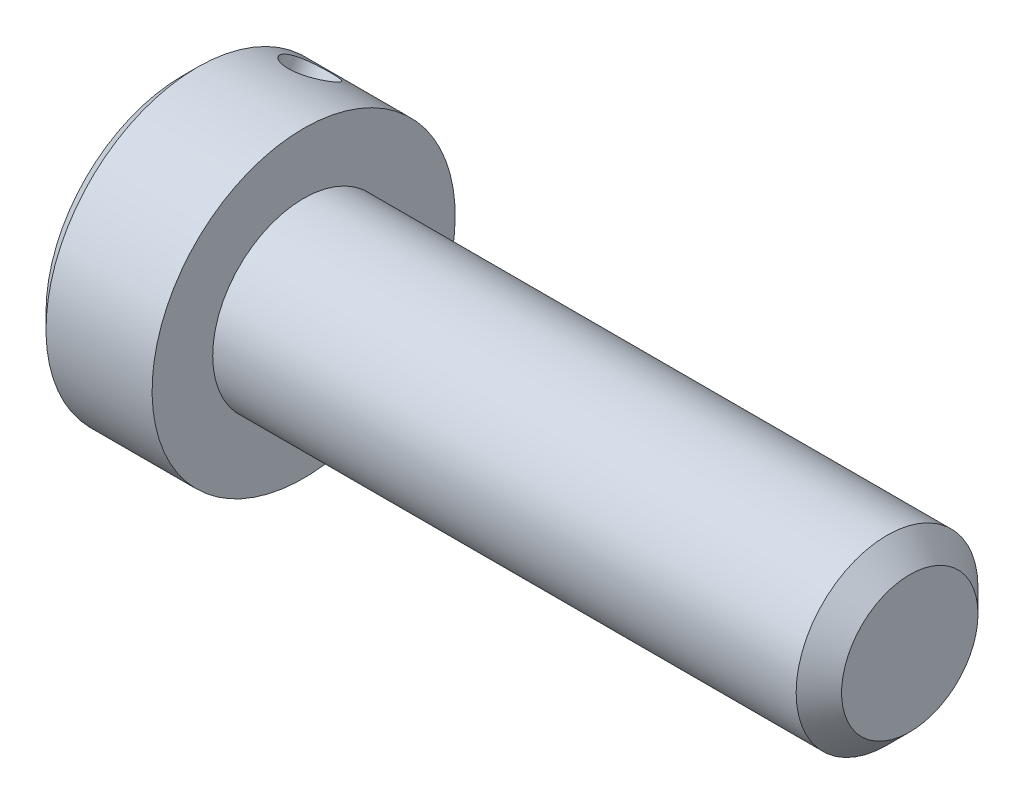
ISO-10303-21;
HEADER;
FILE_DESCRIPTION(('STEP AP214'),'2;1');
FILE_NAME('part.step','',(''),(''),'','','');
FILE_SCHEMA(('AUTOMOTIVE_DESIGN { 1 0 10303 214 1 1 1 1 }'));
ENDSEC;
DATA;
#1=APPLICATION_CONTEXT('core data for automotive mechanical design processes');
#2=APPLICATION_PROTOCOL_DEFINITION('international standard','automotive_design',2000,#1);
#3=PRODUCT_CONTEXT('',#1,'mechanical');
#4=PRODUCT('Part','Part','',(#3));
#5=PRODUCT_RELATED_PRODUCT_CATEGORY('part','',(#4));
#6=PRODUCT_DEFINITION_FORMATION('','',#4);
#7=PRODUCT_DEFINITION_CONTEXT('part definition',#1,'design');
#8=PRODUCT_DEFINITION('design','',#6,#7);
#9=PRODUCT_DEFINITION_SHAPE('','',#8);
#10=(LENGTH_UNIT() NAMED_UNIT(*) SI_UNIT(.MILLI.,.METRE.));
#11=(NAMED_UNIT(*) PLANE_ANGLE_UNIT() SI_UNIT($,.RADIAN.));
#12=(NAMED_UNIT(*) SI_UNIT($,.STERADIAN.) SOLID_ANGLE_UNIT());
#13=UNCERTAINTY_MEASURE_WITH_UNIT(LENGTH_MEASURE(1.E-05),#10,'distance_accuracy_value','');
#14=(GEOMETRIC_REPRESENTATION_CONTEXT(3) GLOBAL_UNCERTAINTY_ASSIGNED_CONTEXT((#13)) GLOBAL_UNIT_ASSIGNED_CONTEXT((#10,
#11,#12)) REPRESENTATION_CONTEXT('',''));
#15=CARTESIAN_POINT('',(0.,0.,0.));
#16=DIRECTION('',(0.,0.,1.));
#17=DIRECTION('',(1.,0.,0.));
#18=AXIS2_PLACEMENT_3D('',#15,#16,#17);
#19=CARTESIAN_POINT('',(-14.,4.5,0.));
#20=DIRECTION('',(-1.,0.,0.));
#21=DIRECTION('',(0.,-1.,0.));
#22=AXIS2_PLACEMENT_3D('',#19,#20,#21);
#23=PLANE('',#22);
#24=CARTESIAN_POINT('',(-14.,0.,0.));
#25=DIRECTION('',(-1.,0.,0.));
#26=DIRECTION('',(0.,-1.,0.));
#27=AXIS2_PLACEMENT_3D('',#24,#25,#26);
#28=CIRCLE('',#27,2.30940107675845);
#29=CARTESIAN_POINT('',(-14.,-2.30940107675842,-1.47451495458029E-13));
#30=VERTEX_POINT('',#29);
#31=CARTESIAN_POINT('',(-14.,-1.15470053837932,1.99999999999988));
#32=VERTEX_POINT('',#31);
#33=EDGE_CURVE('E138',#30,#32,#28,.T.);
#34=ORIENTED_EDGE('',*,*,#33,.F.);
#35=CARTESIAN_POINT('',(-14.,-1.15470053837925,-2.));
#36=VERTEX_POINT('',#35);
#37=EDGE_CURVE('E134',#36,#30,#28,.T.);
#38=ORIENTED_EDGE('',*,*,#37,.F.);
#39=CARTESIAN_POINT('',(-14.,1.15470053837917,-2.));
#40=VERTEX_POINT('',#39);
#41=EDGE_CURVE('E102',#40,#36,#28,.T.);
#42=ORIENTED_EDGE('',*,*,#41,.F.);
#43=CARTESIAN_POINT('',(-14.,2.30940107675848,0.));
#44=VERTEX_POINT('',#43);
#45=EDGE_CURVE('E94',#44,#40,#28,.T.);
#46=ORIENTED_EDGE('',*,*,#45,.F.);
#47=CARTESIAN_POINT('',(-14.,1.15470053837917,2.));
#48=VERTEX_POINT('',#47);
#49=EDGE_CURVE('E55',#48,#44,#28,.T.);
#50=ORIENTED_EDGE('',*,*,#49,.F.);
#51=EDGE_CURVE('E62',#32,#48,#28,.T.);
#52=ORIENTED_EDGE('',*,*,#51,.F.);
#53=EDGE_LOOP('',(#34,#38,#42,#46,#50,#52));
#54=FACE_BOUND('',#53,.T.);
#55=CARTESIAN_POINT('',(-14.,0.,0.));
#56=DIRECTION('',(1.,0.,0.));
#57=DIRECTION('',(0.,1.,0.));
#58=AXIS2_PLACEMENT_3D('',#55,#56,#57);
#59=CIRCLE('',#58,4.5);
#60=CARTESIAN_POINT('',(-14.,4.5,0.));
#61=VERTEX_POINT('',#60);
#62=EDGE_CURVE('E265',#61,#61,#59,.T.);
#63=ORIENTED_EDGE('',*,*,#62,.F.);
#64=EDGE_LOOP('',(#63));
#65=FACE_BOUND('',#64,.T.);
#66=ADVANCED_FACE('F39',(#54,#65),#23,.T.);
#67=CARTESIAN_POINT('',(-10.,0.,0.));
#68=DIRECTION('',(1.,0.,0.));
#69=DIRECTION('',(0.,0.,-1.));
#70=AXIS2_PLACEMENT_3D('',#67,#68,#69);
#71=CYLINDRICAL_SURFACE('',#70,3.);
#72=CARTESIAN_POINT('',(9.25,0.,0.));
#73=DIRECTION('',(1.,0.,0.));
#74=DIRECTION('',(0.,0.,-1.));
#75=AXIS2_PLACEMENT_3D('',#72,#73,#74);
#76=CIRCLE('',#75,3.);
#77=CARTESIAN_POINT('',(9.25,0.,-3.));
#78=VERTEX_POINT('',#77);
#79=EDGE_CURVE('E49',#78,#78,#76,.F.);
#80=ORIENTED_EDGE('',*,*,#79,.T.);
#81=EDGE_LOOP('',(#80));
#82=FACE_BOUND('',#81,.T.);
#83=CARTESIAN_POINT('',(-10.,0.,0.));
#84=DIRECTION('',(1.,0.,0.));
#85=DIRECTION('',(0.,1.,0.));
#86=AXIS2_PLACEMENT_3D('',#83,#84,#85);
#87=CIRCLE('',#86,3.);
#88=CARTESIAN_POINT('',(-10.,2.99999999999999,0.));
#89=VERTEX_POINT('',#88);
#90=EDGE_CURVE('E277',#89,#89,#87,.F.);
#91=ORIENTED_EDGE('',*,*,#90,.F.);
#92=EDGE_LOOP('',(#91));
#93=FACE_BOUND('',#92,.T.);
#94=ADVANCED_FACE('F220',(#82,#93),#71,.T.);
#95=CARTESIAN_POINT('',(10.,0.,0.));
#96=DIRECTION('',(1.,0.,0.));
#97=DIRECTION('',(0.,0.,-1.));
#98=AXIS2_PLACEMENT_3D('',#95,#96,#97);
#99=PLANE('',#98);
#100=CARTESIAN_POINT('',(10.,0.,0.));
#101=DIRECTION('',(1.,0.,0.));
#102=DIRECTION('',(0.,0.,-1.));
#103=AXIS2_PLACEMENT_3D('',#100,#101,#102);
#104=CIRCLE('',#103,2.25);
#105=CARTESIAN_POINT('',(10.,0.,-2.25));
#106=VERTEX_POINT('',#105);
#107=EDGE_CURVE('E281',#106,#106,#104,.T.);
#108=ORIENTED_EDGE('',*,*,#107,.T.);
#109=EDGE_LOOP('',(#108));
#110=FACE_BOUND('',#109,.T.);
#111=ADVANCED_FACE('F228',(#110),#99,.T.);
#112=CARTESIAN_POINT('',(10.,0.,0.));
#113=DIRECTION('',(-1.,0.,0.));
#114=DIRECTION('',(0.,0.,1.));
#115=AXIS2_PLACEMENT_3D('',#112,#113,#114);
#116=CONICAL_SURFACE('',#115,2.25,0.785398163397448);
#117=ORIENTED_EDGE('',*,*,#79,.F.);
#118=EDGE_LOOP('',(#117));
#119=FACE_BOUND('',#118,.T.);
#120=ORIENTED_EDGE('',*,*,#107,.F.);
#121=EDGE_LOOP('',(#120));
#122=FACE_BOUND('',#121,.T.);
#123=ADVANCED_FACE('F41',(#119,#122),#116,.T.);
#124=CARTESIAN_POINT('',(-10.,0.,0.));
#125=DIRECTION('',(1.,0.,0.));
#126=DIRECTION('',(0.,1.,0.));
#127=AXIS2_PLACEMENT_3D('',#124,#125,#126);
#128=CYLINDRICAL_SURFACE('',#127,5.);
#129=CARTESIAN_POINT('',(-12.285299495575,-3.87834086626044,3.15570469548312));
#130=CARTESIAN_POINT('',(-12.3295823347327,-3.87834243769697,3.15570351887923));
#131=CARTESIAN_POINT('',(-12.3738901003137,-3.88072162873428,3.15278569398335));
#132=CARTESIAN_POINT('',(-12.4612645817446,-3.89012873115505,3.14117051017463));
#133=CARTESIAN_POINT('',(-12.5043300804723,-3.89716105014666,3.13246767145505));
#134=CARTESIAN_POINT('',(-12.5879427721785,-3.91552918528988,3.10947684026038));
#135=CARTESIAN_POINT('',(-12.6284919556034,-3.92686154821761,3.09519332916734));
#136=CARTESIAN_POINT('',(-12.7059834838848,-3.95330544361432,3.06134532348772));
#137=CARTESIAN_POINT('',(-12.7429262779357,-3.96841650458992,3.04178148773836));
#138=CARTESIAN_POINT('',(-12.8124921637566,-4.00189331275476,2.99760270517462));
#139=CARTESIAN_POINT('',(-12.8450782819461,-4.02028416199412,2.97294855175529));
#140=CARTESIAN_POINT('',(-12.9046850294694,-4.05946902089804,2.91921476103027));
#141=CARTESIAN_POINT('',(-12.931705340744,-4.08026316779366,2.89013487097986));
#142=CARTESIAN_POINT('',(-12.9795511172846,-4.12354979725005,2.82803379145791));
#143=CARTESIAN_POINT('',(-13.0003423446537,-4.14605084396993,2.79499216816026));
#144=CARTESIAN_POINT('',(-13.0349198712189,-4.19180083409682,2.72589810381854));
#145=CARTESIAN_POINT('',(-13.0487065841393,-4.21504973324537,2.68984584074556));
#146=CARTESIAN_POINT('',(-13.0687711200357,-4.26127783308388,2.61598784846331));
#147=CARTESIAN_POINT('',(-13.0751109706555,-4.28425766002934,2.57819936815398));
#148=CARTESIAN_POINT('',(-13.0802945603456,-4.32940820133291,2.50163925417384));
#149=CARTESIAN_POINT('',(-13.079138763707,-4.35157896571997,2.46286768154537));
#150=CARTESIAN_POINT('',(-13.0694125219117,-4.39429004930405,2.38582031755457));
#151=CARTESIAN_POINT('',(-13.0609088197855,-4.41484323302275,2.34754320242254));
#152=CARTESIAN_POINT('',(-13.036833090799,-4.45405623962589,2.27226438495073));
#153=CARTESIAN_POINT('',(-13.0212608646108,-4.47271600909909,2.23526271860947));
#154=CARTESIAN_POINT('',(-12.9834228241877,-4.50786732771196,2.16350108195712));
#155=CARTESIAN_POINT('',(-12.961129218156,-4.52434945766792,2.12875116136466));
#156=CARTESIAN_POINT('',(-12.910501577852,-4.55482711509662,2.0627345849436));
#157=CARTESIAN_POINT('',(-12.8821670990946,-4.56882245945364,2.031468185689));
#158=CARTESIAN_POINT('',(-12.8198910424476,-4.59433911754537,1.97308797969655));
#159=CARTESIAN_POINT('',(-12.7858911593317,-4.60583149246255,1.946023688727));
#160=CARTESIAN_POINT('',(-12.7134466753072,-4.62608556781917,1.89737420812932));
#161=CARTESIAN_POINT('',(-12.6750020404204,-4.63484724738169,1.875789060391));
#162=CARTESIAN_POINT('',(-12.5946961308765,-4.64963141444188,1.83883824019892));
#163=CARTESIAN_POINT('',(-12.5528316584526,-4.65565130279793,1.82347847074239));
#164=CARTESIAN_POINT('',(-12.4669092097325,-4.66494236949695,1.79957736649697));
#165=CARTESIAN_POINT('',(-12.4228514079421,-4.66821376614666,1.79103549018033));
#166=CARTESIAN_POINT('',(-12.3343046768698,-4.67199432264148,1.78115051456332));
#167=CARTESIAN_POINT('',(-12.2898256059924,-4.67253305614586,1.77973034405443));
#168=CARTESIAN_POINT('',(-12.2012517450004,-4.67092953058149,1.78393446837488));
#169=CARTESIAN_POINT('',(-12.1571569415278,-4.66878736508377,1.78955851734086));
#170=CARTESIAN_POINT('',(-12.0708591705648,-4.66183736057946,1.80758510595588));
#171=CARTESIAN_POINT('',(-12.0286468867392,-4.65704471877549,1.81994899523261));
#172=CARTESIAN_POINT('',(-11.9470176408451,-4.64479853338318,1.85097896845154));
#173=CARTESIAN_POINT('',(-11.9076008320522,-4.63734484402485,1.86964539763869));
#174=CARTESIAN_POINT('',(-11.8323172894324,-4.619707181115,1.91281250797798));
#175=CARTESIAN_POINT('',(-11.7964831584572,-4.60950079850739,1.93736088101744));
#176=CARTESIAN_POINT('',(-11.7297183019373,-4.5864215682139,1.99138088015761));
#177=CARTESIAN_POINT('',(-11.6987878883904,-4.57354855098408,2.02085281927429));
#178=CARTESIAN_POINT('',(-11.642413140731,-4.54509469807838,2.08406439760441));
#179=CARTESIAN_POINT('',(-11.6170230149418,-4.5294895845086,2.11784149161551));
#180=CARTESIAN_POINT('',(-11.5728282856836,-4.4958424139724,2.18836128089123));
#181=CARTESIAN_POINT('',(-11.5540234848388,-4.47780043006653,2.22510388723264));
#182=CARTESIAN_POINT('',(-11.5236186650274,-4.43966501926418,2.30024803298763));
#183=CARTESIAN_POINT('',(-11.5119896604643,-4.41958023238527,2.3386422192264));
#184=CARTESIAN_POINT('',(-11.4961729653704,-4.37774373867863,2.41604924799473));
#185=CARTESIAN_POINT('',(-11.4919847216561,-4.35599215589433,2.45506204431613));
#186=CARTESIAN_POINT('',(-11.4911831781837,-4.31165202264835,2.53211597797378));
#187=CARTESIAN_POINT('',(-11.4944871752472,-4.28907529066116,2.57016308126765));
#188=CARTESIAN_POINT('',(-11.5083982283595,-4.24354467333608,2.64466160898534));
#189=CARTESIAN_POINT('',(-11.519005252429,-4.22059078965015,2.68111304039573));
#190=CARTESIAN_POINT('',(-11.5471906813789,-4.17509062099417,2.75143089863935));
#191=CARTESIAN_POINT('',(-11.5647626873041,-4.1525439817,2.78529966429027));
#192=CARTESIAN_POINT('',(-11.6063702664832,-4.10863869371532,2.84966802011476));
#193=CARTESIAN_POINT('',(-11.6304060996184,-4.08728009283213,2.880167474754));
#194=CARTESIAN_POINT('',(-11.6845551159034,-4.04634364186499,2.9374063422887));
#195=CARTESIAN_POINT('',(-11.7147291139269,-4.02678670561494,2.96410318628258));
#196=CARTESIAN_POINT('',(-11.7801700593476,-3.99050051410446,3.01277774257753));
#197=CARTESIAN_POINT('',(-11.815438198549,-3.9737719225453,3.03475434755035));
#198=CARTESIAN_POINT('',(-11.8903311966474,-3.94377451501699,3.07363811342325));
#199=CARTESIAN_POINT('',(-11.9299823083732,-3.93052835232956,3.09051218384864));
#200=CARTESIAN_POINT('',(-12.012319614853,-3.90826150592398,3.11862411423317));
#201=CARTESIAN_POINT('',(-12.0550026690196,-3.89923652121593,3.12986771195247));
#202=CARTESIAN_POINT('',(-12.1291037891965,-3.88784088650351,3.14400172226503));
#203=CARTESIAN_POINT('',(-12.1600686423158,-3.88428694678735,3.14838517860881));
#204=CARTESIAN_POINT('',(-12.2224513144787,-3.87953639725422,3.15423706018974));
#205=CARTESIAN_POINT('',(-12.2538691264962,-3.87833975091122,3.15570553059431));
#206=CARTESIAN_POINT('',(-12.285299495575,-3.87834086626044,3.15570469548312));
#207=B_SPLINE_CURVE_WITH_KNOTS('',3,(#129,#130,#131,#132,#133,#134,#135,#136,#137,#138,#139,
#140,#141,#142,#143,#144,#145,#146,#147,#148,#149,#150,#151,#152,#153,#154,#155,#156,#157,#158,
#159,#160,#161,#162,#163,#164,#165,#166,#167,#168,#169,#170,#171,#172,#173,#174,#175,#176,#177,
#178,#179,#180,#181,#182,#183,#184,#185,#186,#187,#188,#189,#190,#191,#192,#193,#194,#195,#196,
#197,#198,#199,#200,#201,#202,#203,#204,#205,#206),.UNSPECIFIED.,.T.,.F.,(4,2,2,2,2,2,2,2,2,2,2,
2,2,2,2,2,2,2,2,2,2,2,2,2,2,2,2,2,2,2,2,2,2,2,2,2,2,2,4),(0.,0.132733608923278,
0.265593128174596,0.398346177354536,0.531082670308287,0.66488245045565,0.798689874502196,
0.933219813590063,1.06774180569168,1.20113518539877,1.33452030260671,1.46670643240214,
1.59889628999375,1.73164040679474,1.86439429422823,1.9986099557635,2.1328266433897,
2.26717030121812,2.40150328741235,2.53437933437731,2.66725074371804,2.79936808233928,
2.93149265935071,3.06472711330071,3.19797004086408,3.33246339118621,3.46695271011686,
3.60089516036667,3.73482765224459,3.86728893479908,3.99974963732133,4.13208892492339,
4.26443353408485,4.39815951455836,4.53191683183733,4.66652384201559,4.8009933997057,
4.89520440878158,4.98941395805556),.UNSPECIFIED.);
#208=CARTESIAN_POINT('',(-12.285299495575,-3.87834086626044,3.15570469548312));
#209=VERTEX_POINT('',#208);
#210=EDGE_CURVE('E137',#209,#209,#207,.T.);
#211=ORIENTED_EDGE('',*,*,#210,.F.);
#212=EDGE_LOOP('',(#211));
#213=FACE_BOUND('',#212,.T.);
#214=CARTESIAN_POINT('',(-12.285299495575,4.67209086626044,-1.78088936697532));
#215=CARTESIAN_POINT('',(-12.2410166564173,4.67209063300984,-1.78089131618122));
#216=CARTESIAN_POINT('',(-12.1967088908363,4.67075331804487,-1.78441066850794));
#217=CARTESIAN_POINT('',(-12.1093344094055,4.66539782500728,-1.79836505008468));
#218=CARTESIAN_POINT('',(-12.0662689106777,4.66137710508689,-1.80880663633873));
#219=CARTESIAN_POINT('',(-11.9826562189715,4.65065052878979,-1.83620932359023));
#220=CARTESIAN_POINT('',(-11.9421070355467,4.64394682679185,-1.85316519331707));
#221=CARTESIAN_POINT('',(-11.8646155072652,4.62785554170421,-1.89299028134545));
#222=CARTESIAN_POINT('',(-11.8276727132143,4.6184682934376,-1.91585876190313));
#223=CARTESIAN_POINT('',(-11.7581068273934,4.59694674951156,-1.96693991949337));
#224=CARTESIAN_POINT('',(-11.725520709204,4.5847910509613,-1.99519393884149));
#225=CARTESIAN_POINT('',(-11.6659139616806,4.55784865260375,-2.05599591745851));
#226=CARTESIAN_POINT('',(-11.638893650406,4.54306180252865,-2.08854412194534));
#227=CARTESIAN_POINT('',(-11.5910478738654,4.5109240047884,-2.15708198245976));
#228=CARTESIAN_POINT('',(-11.5702566464963,4.49355964299029,-2.19308927217974));
#229=CARTESIAN_POINT('',(-11.5356791199311,4.4565974230831,-2.26725695802337));
#230=CARTESIAN_POINT('',(-11.5218924070107,4.43699969697225,-2.30541722683253));
#231=CARTESIAN_POINT('',(-11.5018278711143,4.39615084930256,-2.38238093180248));
#232=CARTESIAN_POINT('',(-11.4954880204945,4.374914978857,-2.42117628586649));
#233=CARTESIAN_POINT('',(-11.4903044308045,4.33118724588535,-2.49855785862007));
#234=CARTESIAN_POINT('',(-11.491460227443,4.30869546123796,-2.53714409011482));
#235=CARTESIAN_POINT('',(-11.5011864692383,4.26332602851934,-2.61265665551719));
#236=CARTESIAN_POINT('',(-11.5096901713645,4.24045366629076,-2.64959479231225));
#237=CARTESIAN_POINT('',(-11.533765900351,4.1948668012949,-2.72119366092524));
#238=CARTESIAN_POINT('',(-11.5493381265393,4.17215230299761,-2.75585432848843));
#239=CARTESIAN_POINT('',(-11.5871761669623,4.12758056194596,-2.82217708170986));
#240=CARTESIAN_POINT('',(-11.609469772994,4.10572731291138,-2.85382598525643));
#241=CARTESIAN_POINT('',(-11.660097413298,4.06379410937421,-2.91322869904806));
#242=CARTESIAN_POINT('',(-11.6884318920554,4.04371428551337,-2.94098222242325));
#243=CARTESIAN_POINT('',(-11.7507079487025,4.00591387309161,-2.99227039954659));
#244=CARTESIAN_POINT('',(-11.7847078318184,3.98822169703515,-3.01575523365946));
#245=CARTESIAN_POINT('',(-11.8571523158428,3.95621704863495,-3.0576205177473));
#246=CARTESIAN_POINT('',(-11.8955969507296,3.94190460213039,-3.07600092869742));
#247=CARTESIAN_POINT('',(-11.9759028602736,3.91729633668348,-3.10727980304137));
#248=CARTESIAN_POINT('',(-12.0177673326974,3.90700433031587,-3.12017306401393));
#249=CARTESIAN_POINT('',(-12.1036897814176,3.89095090021035,-3.14016991592625));
#250=CARTESIAN_POINT('',(-12.1477475832079,3.88518911664901,-3.14727396668907));
#251=CARTESIAN_POINT('',(-12.2362943142803,3.8785187548963,-3.15549051246253));
#252=CARTESIAN_POINT('',(-12.2807733851576,3.87755821791008,-3.15666715461764));
#253=CARTESIAN_POINT('',(-12.3693472461496,3.88039733359008,-3.15317639858305));
#254=CARTESIAN_POINT('',(-12.4134420496222,3.88419682011789,-3.14850920435993));
#255=CARTESIAN_POINT('',(-12.4997398205852,3.89633330154991,-3.13347702959527));
#256=CARTESIAN_POINT('',(-12.5419521044108,3.90464442285114,-3.12314453540342));
#257=CARTESIAN_POINT('',(-12.6235813503049,3.92539407524134,-3.09702404114476));
#258=CARTESIAN_POINT('',(-12.6629981590978,3.93783283243618,-3.08123574221496));
#259=CARTESIAN_POINT('',(-12.7382817017176,3.96639781514305,-3.044377522902));
#260=CARTESIAN_POINT('',(-12.7741158326928,3.982554138513,-3.02326434976333));
#261=CARTESIAN_POINT('',(-12.8408806892127,4.01779721493405,-2.97626715045929));
#262=CARTESIAN_POINT('',(-12.8718111027596,4.03688415429298,-2.95038282095657));
#263=CARTESIAN_POINT('',(-12.928185850419,4.07740006048733,-2.89413527233963));
#264=CARTESIAN_POINT('',(-12.9535759762083,4.09884932518206,-2.86373230055371));
#265=CARTESIAN_POINT('',(-12.9977707054664,4.14309766889626,-2.79933310146604));
#266=CARTESIAN_POINT('',(-13.0165755063112,4.16589670743623,-2.76533698189818));
#267=CARTESIAN_POINT('',(-13.0469803261226,4.21190574120456,-2.6947386744821));
#268=CARTESIAN_POINT('',(-13.0586093306857,4.23511368840551,-2.65814764569597));
#269=CARTESIAN_POINT('',(-13.0744260257796,4.28123189489704,-2.58321266495659));
#270=CARTESIAN_POINT('',(-13.0786142694939,4.30414217619189,-2.54486884353217));
#271=CARTESIAN_POINT('',(-13.0794158129663,4.34870277357795,-2.46794219490514));
#272=CARTESIAN_POINT('',(-13.0761118159028,4.37036416557725,-2.42936661982286));
#273=CARTESIAN_POINT('',(-13.0622007627905,4.41211647446277,-2.35268668471051));
#274=CARTESIAN_POINT('',(-13.051593738721,4.43220739822551,-2.31458232261778));
#275=CARTESIAN_POINT('',(-13.0234083097711,4.4703543654762,-2.24001909156342));
#276=CARTESIAN_POINT('',(-13.0058363038459,4.48841225727764,-2.20355874633925));
#277=CARTESIAN_POINT('',(-12.9642287246668,4.52220424462914,-2.1333514736718));
#278=CARTESIAN_POINT('',(-12.9401928915317,4.5379382467067,-2.09960465539804));
#279=CARTESIAN_POINT('',(-12.8860438752466,4.56704033459204,-2.03553321515237));
#280=CARTESIAN_POINT('',(-12.8558698772232,4.58038201156658,-2.0052479895427));
#281=CARTESIAN_POINT('',(-12.7904289318025,4.6043923180807,-1.94948594774056));
#282=CARTESIAN_POINT('',(-12.755160792601,4.61506032049652,-1.92401025999438));
#283=CARTESIAN_POINT('',(-12.6802677945027,4.6337359457731,-1.87858986009074));
#284=CARTESIAN_POINT('',(-12.6406166827768,4.64172623808302,-1.85868131148807));
#285=CARTESIAN_POINT('',(-12.558279376297,4.65493846074266,-1.8253416916464));
#286=CARTESIAN_POINT('',(-12.5155963221304,4.66016320964348,-1.81190402676082));
#287=CARTESIAN_POINT('',(-12.4414952019535,4.6667058042753,-1.79496811245134));
#288=CARTESIAN_POINT('',(-12.4105303488342,4.66872501896731,-1.78969858220173));
#289=CARTESIAN_POINT('',(-12.3481476766713,4.67141762230977,-1.78265854483364));
#290=CARTESIAN_POINT('',(-12.3167298646538,4.67209103181333,-1.78088798349897));
#291=CARTESIAN_POINT('',(-12.285299495575,4.67209086626044,-1.78088936697532));
#292=B_SPLINE_CURVE_WITH_KNOTS('',3,(#214,#215,#216,#217,#218,#219,#220,#221,#222,#223,#224,
#225,#226,#227,#228,#229,#230,#231,#232,#233,#234,#235,#236,#237,#238,#239,#240,#241,#242,#243,
#244,#245,#246,#247,#248,#249,#250,#251,#252,#253,#254,#255,#256,#257,#258,#259,#260,#261,#262,
#263,#264,#265,#266,#267,#268,#269,#270,#271,#272,#273,#274,#275,#276,#277,#278,#279,#280,#281,
#282,#283,#284,#285,#286,#287,#288,#289,#290,#291),.UNSPECIFIED.,.T.,.F.,(4,2,2,2,2,2,2,2,2,2,2,
2,2,2,2,2,2,2,2,2,2,2,2,2,2,2,2,2,2,2,2,2,2,2,2,2,2,2,4),(0.,0.132733608923278,
0.265593128174596,0.398346177354536,0.531082670308288,0.664882450455651,0.798689874502197,
0.933219813590062,1.06774180569168,1.20113518539877,1.33452030260671,1.46670643240214,
1.59889628999375,1.73164040679474,1.86439429422824,1.9986099557635,2.1328266433897,
2.26717030121812,2.40150328741235,2.53437933437731,2.66725074371804,2.79936808233928,
2.93149265935071,3.0647271133007,3.19797004086408,3.33246339118621,3.46695271011686,
3.60089516036667,3.73482765224459,3.86728893479908,3.99974963732133,4.13208892492339,
4.26443353408485,4.39815951455836,4.53191683183733,4.6665238420156,4.80099339970571,
4.89520440878158,4.98941395805556),.UNSPECIFIED.);
#293=CARTESIAN_POINT('',(-12.285299495575,4.67209086626044,-1.78088936697532));
#294=VERTEX_POINT('',#293);
#295=EDGE_CURVE('E230',#294,#294,#292,.T.);
#296=ORIENTED_EDGE('',*,*,#295,.F.);
#297=EDGE_LOOP('',(#296));
#298=FACE_BOUND('',#297,.T.);
#299=CARTESIAN_POINT('',(-13.5,0.,0.));
#300=DIRECTION('',(1.,0.,0.));
#301=DIRECTION('',(0.,1.,0.));
#302=AXIS2_PLACEMENT_3D('',#299,#300,#301);
#303=CIRCLE('',#302,5.);
#304=CARTESIAN_POINT('',(-13.5,4.99999999999999,0.));
#305=VERTEX_POINT('',#304);
#306=EDGE_CURVE('E259',#305,#305,#303,.T.);
#307=ORIENTED_EDGE('',*,*,#306,.T.);
#308=EDGE_LOOP('',(#307));
#309=FACE_BOUND('',#308,.T.);
#310=CARTESIAN_POINT('',(-10.,0.,0.));
#311=DIRECTION('',(1.,0.,0.));
#312=DIRECTION('',(0.,1.,0.));
#313=AXIS2_PLACEMENT_3D('',#310,#311,#312);
#314=CIRCLE('',#313,5.);
#315=CARTESIAN_POINT('',(-10.,5.,0.));
#316=VERTEX_POINT('',#315);
#317=EDGE_CURVE('E262',#316,#316,#314,.T.);
#318=ORIENTED_EDGE('',*,*,#317,.F.);
#319=EDGE_LOOP('',(#318));
#320=FACE_BOUND('',#319,.T.);
#321=ADVANCED_FACE('F222',(#213,#298,#309,#320),#128,.T.);
#322=CARTESIAN_POINT('',(-13.5,0.,0.));
#323=DIRECTION('',(1.,0.,0.));
#324=DIRECTION('',(0.,1.,0.));
#325=AXIS2_PLACEMENT_3D('',#322,#323,#324);
#326=CONICAL_SURFACE('',#325,5.,0.785398163397447);
#327=ORIENTED_EDGE('',*,*,#62,.T.);
#328=EDGE_LOOP('',(#327));
#329=FACE_BOUND('',#328,.T.);
#330=ORIENTED_EDGE('',*,*,#306,.F.);
#331=EDGE_LOOP('',(#330));
#332=FACE_BOUND('',#331,.T.);
#333=ADVANCED_FACE('F216',(#329,#332),#326,.T.);
#334=CARTESIAN_POINT('',(-10.,5.,0.));
#335=DIRECTION('',(1.,0.,0.));
#336=DIRECTION('',(0.,1.,0.));
#337=AXIS2_PLACEMENT_3D('',#334,#335,#336);
#338=PLANE('',#337);
#339=ORIENTED_EDGE('',*,*,#90,.T.);
#340=EDGE_LOOP('',(#339));
#341=FACE_BOUND('',#340,.T.);
#342=ORIENTED_EDGE('',*,*,#317,.T.);
#343=EDGE_LOOP('',(#342));
#344=FACE_BOUND('',#343,.T.);
#345=ADVANCED_FACE('F171',(#341,#344),#338,.T.);
#346=CARTESIAN_POINT('',(-14.,0.,0.));
#347=DIRECTION('',(-1.,0.,0.));
#348=DIRECTION('',(0.,-1.,0.));
#349=AXIS2_PLACEMENT_3D('',#346,#347,#348);
#350=CONICAL_SURFACE('',#349,2.30940107675845,0.78539816339745);
#351=CARTESIAN_POINT('',(-14.7407713552808,-2.30294417326428,-2.));
#352=CARTESIAN_POINT('',(-14.6984432738693,-2.24687002696277,-2.));
#353=CARTESIAN_POINT('',(-14.6565251570979,-2.19048190568581,-2.));
#354=CARTESIAN_POINT('',(-14.5736904180752,-2.0769539052615,-2.));
#355=CARTESIAN_POINT('',(-14.5327740498726,-2.01981384095227,-2.));
#356=CARTESIAN_POINT('',(-14.4518334522037,-1.90424016831612,-2.));
#357=CARTESIAN_POINT('',(-14.4118185917352,-1.84579996769761,-2.));
#358=CARTESIAN_POINT('',(-14.3332889938203,-1.72792745485623,-2.));
#359=CARTESIAN_POINT('',(-14.2947741503896,-1.66849521315184,-2.));
#360=CARTESIAN_POINT('',(-14.1776406517203,-1.48162995729571,-2.));
#361=CARTESIAN_POINT('',(-14.1021459018253,-1.35220318180734,-2.));
#362=CARTESIAN_POINT('',(-13.9640493510524,-1.08689521605217,-2.));
#363=CARTESIAN_POINT('',(-13.9014040859441,-0.9510377640356,-2.));
#364=CARTESIAN_POINT('',(-13.8247635439028,-0.747111912337621,-2.));
#365=CARTESIAN_POINT('',(-13.8027671799473,-0.682064034234127,-2.));
#366=CARTESIAN_POINT('',(-13.7639966876877,-0.550398103397343,-2.));
#367=CARTESIAN_POINT('',(-13.7472229191476,-0.483779942833367,-2.));
#368=CARTESIAN_POINT('',(-13.7200482579068,-0.350484328974875,-2.));
#369=CARTESIAN_POINT('',(-13.709538176761,-0.28382948950003,-2.));
#370=CARTESIAN_POINT('',(-13.6950960855565,-0.1498069872904,-2.));
#371=CARTESIAN_POINT('',(-13.69116294474,-0.0824394490928999,-2.));
#372=CARTESIAN_POINT('',(-13.6901664769297,0.0499055621214035,-2.));
#373=CARTESIAN_POINT('',(-13.6928596448403,0.114881284963513,-2.));
#374=CARTESIAN_POINT('',(-13.7044300703996,0.244275921290612,-2.));
#375=CARTESIAN_POINT('',(-13.7133079288032,0.30869478006869,-2.));
#376=CARTESIAN_POINT('',(-13.7369136592515,0.437599788400963,-2.));
#377=CARTESIAN_POINT('',(-13.7517410833942,0.502067428429108,-2.));
#378=CARTESIAN_POINT('',(-13.7864578835601,0.629594322371884,-2.));
#379=CARTESIAN_POINT('',(-13.8063468360306,0.692653693651538,-2.));
#380=CARTESIAN_POINT('',(-13.8764469791435,0.891187888928493,-2.));
#381=CARTESIAN_POINT('',(-13.9346418001747,1.02383545674829,-2.));
#382=CARTESIAN_POINT('',(-14.0640305752409,1.2829093210938,-2.));
#383=CARTESIAN_POINT('',(-14.1352712311583,1.40931112542935,-2.));
#384=CARTESIAN_POINT('',(-14.2464419915628,1.59200441388857,-2.));
#385=CARTESIAN_POINT('',(-14.2831821900084,1.65027548974484,-2.));
#386=CARTESIAN_POINT('',(-14.3582145138206,1.76581760334356,-2.));
#387=CARTESIAN_POINT('',(-14.3965067567377,1.8230885648664,-2.));
#388=CARTESIAN_POINT('',(-14.4740422636669,1.93629654702502,-2.));
#389=CARTESIAN_POINT('',(-14.5132752757023,1.99224062439417,-2.));
#390=CARTESIAN_POINT('',(-14.5927788302714,2.10336423965707,-2.));
#391=CARTESIAN_POINT('',(-14.6330490845185,2.15854398356746,-2.));
#392=CARTESIAN_POINT('',(-14.673744237647,2.21340370625409,-2.));
#393=B_SPLINE_CURVE_WITH_KNOTS('',3,(#351,#352,#353,#354,#355,#356,#357,#358,#359,#360,#361,
#362,#363,#364,#365,#366,#367,#368,#369,#370,#371,#372,#373,#374,#375,#376,#377,#378,#379,#380,
#381,#382,#383,#384,#385,#386,#387,#388,#389,#390,#391,#392),.UNSPECIFIED.,.F.,.F.,(4,2,2,2,2,2,
2,2,2,2,2,2,2,2,2,2,2,2,2,2,4),(0.,0.210772732017011,0.421598374738841,0.634057554744624,
0.846501696032186,1.29562155480994,1.74319622856098,1.94902062142336,2.15485918958133,
2.35699582530217,2.55909770457496,2.75388435576876,2.94868993036095,3.14690093471671,
3.34509535806593,3.77838155838773,4.21325029906867,4.41989056664098,4.6265465143258,
4.83152377076249,5.03644465872345),.UNSPECIFIED.);
#394=EDGE_CURVE('E11',#36,#40,#393,.T.);
#395=ORIENTED_EDGE('',*,*,#394,.T.);
#396=ORIENTED_EDGE('',*,*,#41,.T.);
#397=EDGE_LOOP('',(#395,#396));
#398=FACE_BOUND('',#397,.T.);
#399=ADVANCED_FACE('F107',(#398),#350,.F.);
#400=CARTESIAN_POINT('',(-14.0001154787138,-2.30951654681234,0.000200000000000397));
#401=CARTESIAN_POINT('',(-13.9604530902257,-2.26982196410711,-0.0685530340307059));
#402=CARTESIAN_POINT('',(-13.9231199822843,-2.22946361676571,-0.138455742135513));
#403=CARTESIAN_POINT('',(-13.8547636851362,-2.1471683966763,-0.280995244550439));
#404=CARTESIAN_POINT('',(-13.8237785337373,-2.10522369580641,-0.353645597565362));
#405=CARTESIAN_POINT('',(-13.7707002165442,-2.02064418875706,-0.500141601053977));
#406=CARTESIAN_POINT('',(-13.7484736271767,-1.97803092714268,-0.573949935246301));
#407=CARTESIAN_POINT('',(-13.7142288166752,-1.89186619344272,-0.723191631835273));
#408=CARTESIAN_POINT('',(-13.7021850291442,-1.84831735425552,-0.798620433918162));
#409=CARTESIAN_POINT('',(-13.6913185119057,-1.77326466747239,-0.928615500671091));
#410=CARTESIAN_POINT('',(-13.6897097536101,-1.74185780396624,-0.983013783970121));
#411=CARTESIAN_POINT('',(-13.6924188775988,-1.67909540053411,-1.09172145551971));
#412=CARTESIAN_POINT('',(-13.6967388377581,-1.64773988246021,-1.14603080592135));
#413=CARTESIAN_POINT('',(-13.71105956741,-1.58532489948419,-1.25413672758935));
#414=CARTESIAN_POINT('',(-13.7210666927621,-1.55426580541468,-1.30793265655481));
#415=CARTESIAN_POINT('',(-13.7462124302497,-1.49268469862227,-1.41459426230559));
#416=CARTESIAN_POINT('',(-13.7613506490423,-1.46216264491916,-1.46746001007073));
#417=CARTESIAN_POINT('',(-13.8062945034293,-1.38397803138048,-1.60287973308986));
#418=CARTESIAN_POINT('',(-13.8394888394259,-1.33680037273297,-1.68459383484949));
#419=CARTESIAN_POINT('',(-13.8955258231715,-1.26742988897853,-1.80474703725781));
#420=CARTESIAN_POINT('',(-13.915214702947,-1.2445692346153,-1.84434285210918));
#421=CARTESIAN_POINT('',(-13.9563873183649,-1.19927142554652,-1.92280095888787));
#422=CARTESIAN_POINT('',(-13.9778699516513,-1.17683402097614,-1.96166368359374));
#423=CARTESIAN_POINT('',(-14.0001154787137,-1.15458506832541,-2.0002));
#424=B_SPLINE_CURVE_WITH_KNOTS('',3,(#400,#401,#402,#403,#404,#405,#406,#407,#408,#409,#410,
#411,#412,#413,#414,#415,#416,#417,#418,#419,#420,#421,#422,#423),.UNSPECIFIED.,.F.,.F.,(4,2,2,
2,2,2,2,2,2,2,2,4),(0.,0.266420613771067,0.534393751523395,0.798110374376925,1.06116288956938,
1.24939906803723,1.43770123566249,1.62621426093934,1.81471283831916,2.11415604834146,
2.26347170717791,2.4126962696977),.UNSPECIFIED.);
#425=EDGE_CURVE('E142',#30,#36,#424,.T.);
#426=ORIENTED_EDGE('',*,*,#425,.T.);
#427=ORIENTED_EDGE('',*,*,#37,.T.);
#428=EDGE_LOOP('',(#426,#427));
#429=FACE_BOUND('',#428,.T.);
#430=ADVANCED_FACE('F170',(#429),#350,.F.);
#431=CARTESIAN_POINT('',(-14.0001154787137,-1.15458506832541,2.0002));
#432=CARTESIAN_POINT('',(-13.9604530902257,-1.19427965103064,1.93144696596929));
#433=CARTESIAN_POINT('',(-13.9231199822842,-1.23463799837204,1.86154425786449));
#434=CARTESIAN_POINT('',(-13.8547636851362,-1.31693321846145,1.71900475544957));
#435=CARTESIAN_POINT('',(-13.8237785337373,-1.35887791933134,1.64635440243464));
#436=CARTESIAN_POINT('',(-13.7707002165442,-1.44345742638069,1.49985839894603));
#437=CARTESIAN_POINT('',(-13.7484736271767,-1.48607068799506,1.42605006475371));
#438=CARTESIAN_POINT('',(-13.7142288166752,-1.57223542169502,1.27680836816474));
#439=CARTESIAN_POINT('',(-13.7021850291442,-1.61578426088223,1.20137956608186));
#440=CARTESIAN_POINT('',(-13.6913185119057,-1.69083694766535,1.07138449932893));
#441=CARTESIAN_POINT('',(-13.6897097536101,-1.7222438111715,1.0169862160299));
#442=CARTESIAN_POINT('',(-13.6924188775988,-1.78500621460363,0.908278544480313));
#443=CARTESIAN_POINT('',(-13.6967388377581,-1.81636173267754,0.853969194078667));
#444=CARTESIAN_POINT('',(-13.71105956741,-1.87877671565355,0.745863272410667));
#445=CARTESIAN_POINT('',(-13.7210666927621,-1.90983580972306,0.692067343445212));
#446=CARTESIAN_POINT('',(-13.7462124302498,-1.97141691651547,0.58540573769443));
#447=CARTESIAN_POINT('',(-13.7613506490423,-2.00193897021859,0.532539989929291));
#448=CARTESIAN_POINT('',(-13.8062945034293,-2.08012358375727,0.397120266910158));
#449=CARTESIAN_POINT('',(-13.8394888394259,-2.12730124240478,0.315406165150523));
#450=CARTESIAN_POINT('',(-13.8955258231715,-2.19667172615922,0.195252962742198));
#451=CARTESIAN_POINT('',(-13.915214702947,-2.21953238052245,0.155657147890823));
#452=CARTESIAN_POINT('',(-13.956387318365,-2.26483018959124,0.0771990411121281));
#453=CARTESIAN_POINT('',(-13.9778699516513,-2.28726759416161,0.0383363164062602));
#454=CARTESIAN_POINT('',(-14.0001154787138,-2.30951654681234,-0.000199999999999328));
#455=B_SPLINE_CURVE_WITH_KNOTS('',3,(#431,#432,#433,#434,#435,#436,#437,#438,#439,#440,#441,
#442,#443,#444,#445,#446,#447,#448,#449,#450,#451,#452,#453,#454),.UNSPECIFIED.,.F.,.F.,(4,2,2,
2,2,2,2,2,2,2,2,4),(0.,0.266420613771061,0.534393751523382,0.798110374376904,1.06116288956935,
1.2493990680372,1.43770123566246,1.62621426093931,1.81471283831913,2.11415604834144,
2.2634717071779,2.4126962696977),.UNSPECIFIED.);
#456=EDGE_CURVE('E157',#32,#30,#455,.T.);
#457=ORIENTED_EDGE('',*,*,#456,.T.);
#458=ORIENTED_EDGE('',*,*,#33,.T.);
#459=EDGE_LOOP('',(#457,#458));
#460=FACE_BOUND('',#459,.T.);
#461=ADVANCED_FACE('F326',(#460),#350,.F.);
#462=CARTESIAN_POINT('',(-14.7407713550278,-2.30294417292921,2.));
#463=CARTESIAN_POINT('',(-14.698443273626,-2.2468700266371,2.));
#464=CARTESIAN_POINT('',(-14.6565251568644,-2.19048190536957,2.));
#465=CARTESIAN_POINT('',(-14.5736904178611,-2.07695390496422,2.));
#466=CARTESIAN_POINT('',(-14.5327740496681,-2.01981384066452,2.));
#467=CARTESIAN_POINT('',(-14.4518334520186,-1.90424016804773,2.));
#468=CARTESIAN_POINT('',(-14.4118185915599,-1.84579996743907,2.));
#469=CARTESIAN_POINT('',(-14.3332889936644,-1.72792745461758,2.));
#470=CARTESIAN_POINT('',(-14.2947741502432,-1.66849521292321,2.));
#471=CARTESIAN_POINT('',(-14.1776406516044,-1.48162995710017,2.));
#472=CARTESIAN_POINT('',(-14.1021459017297,-1.35220318163534,2.));
#473=CARTESIAN_POINT('',(-13.9640493509944,-1.08689521592922,2.));
#474=CARTESIAN_POINT('',(-13.9014040859036,-0.951037763938166,2.));
#475=CARTESIAN_POINT('',(-13.8247635438752,-0.747111912259382,2.));
#476=CARTESIAN_POINT('',(-13.8027671799192,-0.682064034147849,2.));
#477=CARTESIAN_POINT('',(-13.7639966876602,-0.550398103294726,2.));
#478=CARTESIAN_POINT('',(-13.7472229191212,-0.483779942722449,2.));
#479=CARTESIAN_POINT('',(-13.7200482578845,-0.350484328847628,2.));
#480=CARTESIAN_POINT('',(-13.7095381767417,-0.283829489364759,2.));
#481=CARTESIAN_POINT('',(-13.695096085545,-0.14980698713935,2.));
#482=CARTESIAN_POINT('',(-13.6911629447332,-0.0824394489340956,2.));
#483=CARTESIAN_POINT('',(-13.6901664769338,0.0499055622945162,2.));
#484=CARTESIAN_POINT('',(-13.6928596448505,0.114881285143199,2.));
#485=CARTESIAN_POINT('',(-13.7044300704227,0.244275921482788,2.));
#486=CARTESIAN_POINT('',(-13.7133079288333,0.308694780266781,2.));
#487=CARTESIAN_POINT('',(-13.7369136592962,0.437599788610733,2.));
#488=CARTESIAN_POINT('',(-13.7517410834466,0.502067428644624,2.));
#489=CARTESIAN_POINT('',(-13.786457883628,0.629594322598335,2.));
#490=CARTESIAN_POINT('',(-13.8063468361063,0.69265369388318,2.));
#491=CARTESIAN_POINT('',(-13.8764469792563,0.891187889210574,2.));
#492=CARTESIAN_POINT('',(-13.9346418003216,1.02383545707309,2.));
#493=CARTESIAN_POINT('',(-14.0640305754596,1.28290932150077,2.));
#494=CARTESIAN_POINT('',(-14.1352712314149,1.40931112587573,2.));
#495=CARTESIAN_POINT('',(-14.2464419918748,1.59200441438966,2.));
#496=CARTESIAN_POINT('',(-14.2831821903374,1.65027549026194,2.));
#497=CARTESIAN_POINT('',(-14.3582145141838,1.76581760389245,2.));
#498=CARTESIAN_POINT('',(-14.3965067571181,1.82308856543107,2.));
#499=CARTESIAN_POINT('',(-14.4740422640813,1.93629654762087,2.));
#500=CARTESIAN_POINT('',(-14.5132752761336,1.99224062500542,2.));
#501=CARTESIAN_POINT('',(-14.5927788307366,2.10336424029903,2.));
#502=CARTESIAN_POINT('',(-14.6330490850006,2.15854398422471,2.));
#503=CARTESIAN_POINT('',(-14.673744238146,2.21340370692662,2.));
#504=B_SPLINE_CURVE_WITH_KNOTS('',3,(#462,#463,#464,#465,#466,#467,#468,#469,#470,#471,#472,
#473,#474,#475,#476,#477,#478,#479,#480,#481,#482,#483,#484,#485,#486,#487,#488,#489,#490,#491,
#492,#493,#494,#495,#496,#497,#498,#499,#500,#501,#502,#503),.UNSPECIFIED.,.F.,.F.,(4,2,2,2,2,2,
2,2,2,2,2,2,2,2,2,2,2,2,2,2,4),(0.,0.210772731976893,0.421598374658593,0.634057554623494,
0.846501695870177,1.29562155455625,1.74319622821646,1.94902062110208,2.15485918928327,
2.35699582502636,2.55909770432141,2.75388435553557,2.94868993014816,3.14690093452587,
3.34509535789703,3.77838155837655,4.21325029921626,4.41989056685648,4.62654651460922,
4.8315237711129,5.03644465914086),.UNSPECIFIED.);
#505=EDGE_CURVE('E185',#48,#32,#504,.F.);
#506=ORIENTED_EDGE('',*,*,#505,.T.);
#507=ORIENTED_EDGE('',*,*,#51,.T.);
#508=EDGE_LOOP('',(#506,#507));
#509=FACE_BOUND('',#508,.T.);
#510=ADVANCED_FACE('F335',(#509),#350,.F.);
#511=CARTESIAN_POINT('',(-14.0001154787137,2.30951654681234,-0.000200000000000116));
#512=CARTESIAN_POINT('',(-13.9604530902256,2.26982196410711,0.0685530340307047));
#513=CARTESIAN_POINT('',(-13.9231199822842,2.22946361676572,0.13845574213551));
#514=CARTESIAN_POINT('',(-13.8547636851362,2.14716839667631,0.280995244550433));
#515=CARTESIAN_POINT('',(-13.8237785337372,2.10522369580642,0.353645597565354));
#516=CARTESIAN_POINT('',(-13.7707002165442,2.02064418875707,0.500141601053965));
#517=CARTESIAN_POINT('',(-13.7484736271766,1.97803092714269,0.573949935246287));
#518=CARTESIAN_POINT('',(-13.7142288166751,1.89186619344273,0.723191631835256));
#519=CARTESIAN_POINT('',(-13.7021850291442,1.84831735425553,0.798620433918142));
#520=CARTESIAN_POINT('',(-13.6913185119056,1.7732646674724,0.928615500671068));
#521=CARTESIAN_POINT('',(-13.68970975361,1.74185780396625,0.983013783970097));
#522=CARTESIAN_POINT('',(-13.6924188775987,1.67909540053413,1.09172145551968));
#523=CARTESIAN_POINT('',(-13.696738837758,1.64773988246022,1.14603080592133));
#524=CARTESIAN_POINT('',(-13.7110595674099,1.58532489948421,1.25413672758932));
#525=CARTESIAN_POINT('',(-13.721066692762,1.5542658054147,1.30793265655478));
#526=CARTESIAN_POINT('',(-13.7462124302497,1.49268469862229,1.41459426230556));
#527=CARTESIAN_POINT('',(-13.7613506490423,1.46216264491918,1.4674600100707));
#528=CARTESIAN_POINT('',(-13.8062945034292,1.38397803138049,1.60287973308983));
#529=CARTESIAN_POINT('',(-13.8394888394258,1.33680037273298,1.68459383484947));
#530=CARTESIAN_POINT('',(-13.8955258231714,1.26742988897854,1.8047470372578));
#531=CARTESIAN_POINT('',(-13.915214702947,1.24456923461531,1.84434285210917));
#532=CARTESIAN_POINT('',(-13.9563873183649,1.19927142554652,1.92280095888787));
#533=CARTESIAN_POINT('',(-13.9778699516513,1.17683402097614,1.96166368359374));
#534=CARTESIAN_POINT('',(-14.0001154787137,1.15458506832541,2.0002));
#535=B_SPLINE_CURVE_WITH_KNOTS('',3,(#511,#512,#513,#514,#515,#516,#517,#518,#519,#520,#521,
#522,#523,#524,#525,#526,#527,#528,#529,#530,#531,#532,#533,#534),.UNSPECIFIED.,.F.,.F.,(4,2,2,
2,2,2,2,2,2,2,2,4),(0.,0.266420613771061,0.534393751523381,0.798110374376904,1.06116288956935,
1.2493990680372,1.43770123566246,1.6262142609393,1.81471283831911,2.11415604834144,
2.2634717071779,2.41269626969771),.UNSPECIFIED.);
#536=EDGE_CURVE('E123',#44,#48,#535,.T.);
#537=ORIENTED_EDGE('',*,*,#536,.T.);
#538=ORIENTED_EDGE('',*,*,#49,.T.);
#539=EDGE_LOOP('',(#537,#538));
#540=FACE_BOUND('',#539,.T.);
#541=ADVANCED_FACE('F344',(#540),#350,.F.);
#542=CARTESIAN_POINT('',(-14.0001154787137,1.15458506832541,-2.0002));
#543=CARTESIAN_POINT('',(-13.9604530902256,1.19427965103065,-1.93144696596929));
#544=CARTESIAN_POINT('',(-13.9231199822842,1.23463799837204,-1.86154425786449));
#545=CARTESIAN_POINT('',(-13.8547636851362,1.31693321846145,-1.71900475544956));
#546=CARTESIAN_POINT('',(-13.8237785337373,1.35887791933134,-1.64635440243464));
#547=CARTESIAN_POINT('',(-13.7707002165442,1.4434574263807,-1.49985839894602));
#548=CARTESIAN_POINT('',(-13.7484736271766,1.48607068799507,-1.4260500647537));
#549=CARTESIAN_POINT('',(-13.7142288166751,1.57223542169503,-1.27680836816473));
#550=CARTESIAN_POINT('',(-13.7021850291442,1.61578426088224,-1.20137956608184));
#551=CARTESIAN_POINT('',(-13.6913185119056,1.69083694766536,-1.07138449932891));
#552=CARTESIAN_POINT('',(-13.68970975361,1.72224381117151,-1.01698621602988));
#553=CARTESIAN_POINT('',(-13.6924188775987,1.78500621460364,-0.908278544480295));
#554=CARTESIAN_POINT('',(-13.696738837758,1.81636173267755,-0.85396919407865));
#555=CARTESIAN_POINT('',(-13.7110595674099,1.87877671565356,-0.745863272410652));
#556=CARTESIAN_POINT('',(-13.721066692762,1.90983580972307,-0.692067343445199));
#557=CARTESIAN_POINT('',(-13.7462124302497,1.97141691651548,-0.585405737694419));
#558=CARTESIAN_POINT('',(-13.7613506490423,2.00193897021859,-0.53253998992928));
#559=CARTESIAN_POINT('',(-13.8062945034292,2.08012358375727,-0.39712026691015));
#560=CARTESIAN_POINT('',(-13.8394888394258,2.12730124240478,-0.315406165150516));
#561=CARTESIAN_POINT('',(-13.8955258231714,2.19667172615922,-0.195252962742194));
#562=CARTESIAN_POINT('',(-13.915214702947,2.21953238052245,-0.15565714789082));
#563=CARTESIAN_POINT('',(-13.9563873183649,2.26483018959124,-0.0771990411121263));
#564=CARTESIAN_POINT('',(-13.9778699516513,2.28726759416161,-0.0383363164062589));
#565=CARTESIAN_POINT('',(-14.0001154787137,2.30951654681234,0.000200000000000093));
#566=B_SPLINE_CURVE_WITH_KNOTS('',3,(#542,#543,#544,#545,#546,#547,#548,#549,#550,#551,#552,
#553,#554,#555,#556,#557,#558,#559,#560,#561,#562,#563,#564,#565),.UNSPECIFIED.,.F.,.F.,(4,2,2,
2,2,2,2,2,2,2,2,4),(0.,0.266420613771068,0.534393751523397,0.798110374376927,1.06116288956938,
1.24939906803723,1.43770123566249,1.62621426093933,1.81471283831914,2.11415604834145,
2.26347170717791,2.41269626969771),.UNSPECIFIED.);
#567=EDGE_CURVE('E97',#40,#44,#566,.T.);
#568=ORIENTED_EDGE('',*,*,#567,.T.);
#569=ORIENTED_EDGE('',*,*,#45,.T.);
#570=EDGE_LOOP('',(#568,#569));
#571=FACE_BOUND('',#570,.T.);
#572=ADVANCED_FACE('F95',(#571),#350,.F.);
#573=CARTESIAN_POINT('',(-10.88,2.3094010767585,0.));
#574=DIRECTION('',(1.,0.,0.));
#575=DIRECTION('',(0.,0.,-1.));
#576=AXIS2_PLACEMENT_3D('',#573,#574,#575);
#577=PLANE('',#576);
#578=DIRECTION('',(0.,0.5,0.866025403784439));
#579=VECTOR('',#578,1.);
#580=CARTESIAN_POINT('',(-10.88,1.15470053837925,-2.));
#581=LINE('',#580,#579);
#582=CARTESIAN_POINT('',(-10.88,1.15470053837925,-2.));
#583=VERTEX_POINT('',#582);
#584=CARTESIAN_POINT('',(-10.88,2.3094010767585,0.));
#585=VERTEX_POINT('',#584);
#586=EDGE_CURVE('E122',#583,#585,#581,.T.);
#587=ORIENTED_EDGE('',*,*,#586,.F.);
#588=DIRECTION('',(0.,1.,0.));
#589=VECTOR('',#588,1.);
#590=CARTESIAN_POINT('',(-10.88,-1.15470053837925,-2.));
#591=LINE('',#590,#589);
#592=CARTESIAN_POINT('',(-10.88,-1.15470053837925,-2.));
#593=VERTEX_POINT('',#592);
#594=EDGE_CURVE('E127',#593,#583,#591,.T.);
#595=ORIENTED_EDGE('',*,*,#594,.F.);
#596=DIRECTION('',(0.,0.5,-0.866025403784439));
#597=VECTOR('',#596,1.);
#598=CARTESIAN_POINT('',(-10.88,-2.3094010767585,0.));
#599=LINE('',#598,#597);
#600=CARTESIAN_POINT('',(-10.88,-2.3094010767585,0.));
#601=VERTEX_POINT('',#600);
#602=EDGE_CURVE('E454',#601,#593,#599,.T.);
#603=ORIENTED_EDGE('',*,*,#602,.F.);
#604=DIRECTION('',(0.,-0.5,-0.866025403784439));
#605=VECTOR('',#604,1.);
#606=CARTESIAN_POINT('',(-10.88,-1.15470053837925,2.));
#607=LINE('',#606,#605);
#608=CARTESIAN_POINT('',(-10.88,-1.15470053837925,2.));
#609=VERTEX_POINT('',#608);
#610=EDGE_CURVE('E451',#609,#601,#607,.T.);
#611=ORIENTED_EDGE('',*,*,#610,.F.);
#612=DIRECTION('',(0.,-1.,0.));
#613=VECTOR('',#612,1.);
#614=CARTESIAN_POINT('',(-10.88,1.15470053837925,2.));
#615=LINE('',#614,#613);
#616=CARTESIAN_POINT('',(-10.88,1.15470053837925,2.));
#617=VERTEX_POINT('',#616);
#618=EDGE_CURVE('E439',#617,#609,#615,.T.);
#619=ORIENTED_EDGE('',*,*,#618,.F.);
#620=DIRECTION('',(0.,-0.5,0.866025403784439));
#621=VECTOR('',#620,1.);
#622=CARTESIAN_POINT('',(-10.88,2.3094010767585,0.));
#623=LINE('',#622,#621);
#624=EDGE_CURVE('E447',#585,#617,#623,.T.);
#625=ORIENTED_EDGE('',*,*,#624,.F.);
#626=EDGE_LOOP('',(#587,#595,#603,#611,#619,#625));
#627=FACE_BOUND('',#626,.T.);
#628=ADVANCED_FACE('F174',(#627),#577,.F.);
#629=CARTESIAN_POINT('',(-10.88,-1.15470053837925,-2.));
#630=DIRECTION('',(0.,0.,1.));
#631=DIRECTION('',(0.,-1.,0.));
#632=AXIS2_PLACEMENT_3D('',#629,#630,#631);
#633=PLANE('',#632);
#634=ORIENTED_EDGE('',*,*,#394,.F.);
#635=DIRECTION('',(-1.,0.,0.));
#636=VECTOR('',#635,1.);
#637=CARTESIAN_POINT('',(-10.88,-1.15470053837925,-2.));
#638=LINE('',#637,#636);
#639=EDGE_CURVE('E129',#593,#36,#638,.T.);
#640=ORIENTED_EDGE('',*,*,#639,.F.);
#641=ORIENTED_EDGE('',*,*,#594,.T.);
#642=DIRECTION('',(-1.,0.,0.));
#643=VECTOR('',#642,1.);
#644=CARTESIAN_POINT('',(-10.88,1.15470053837925,-2.));
#645=LINE('',#644,#643);
#646=EDGE_CURVE('E117',#583,#40,#645,.T.);
#647=ORIENTED_EDGE('',*,*,#646,.T.);
#648=EDGE_LOOP('',(#634,#640,#641,#647));
#649=FACE_BOUND('',#648,.T.);
#650=ADVANCED_FACE('F125',(#649),#633,.T.);
#651=CARTESIAN_POINT('',(-10.88,-2.3094010767585,0.));
#652=DIRECTION('',(0.,0.866025403784439,0.5));
#653=DIRECTION('',(0.,-0.5,0.866025403784439));
#654=AXIS2_PLACEMENT_3D('',#651,#652,#653);
#655=PLANE('',#654);
#656=ORIENTED_EDGE('',*,*,#425,.F.);
#657=DIRECTION('',(-1.,0.,0.));
#658=VECTOR('',#657,1.);
#659=CARTESIAN_POINT('',(-10.88,-2.3094010767585,0.));
#660=LINE('',#659,#658);
#661=EDGE_CURVE('E432',#601,#30,#660,.T.);
#662=ORIENTED_EDGE('',*,*,#661,.F.);
#663=ORIENTED_EDGE('',*,*,#602,.T.);
#664=ORIENTED_EDGE('',*,*,#639,.T.);
#665=EDGE_LOOP('',(#656,#662,#663,#664));
#666=FACE_BOUND('',#665,.T.);
#667=ADVANCED_FACE('F164',(#666),#655,.T.);
#668=CARTESIAN_POINT('',(-10.88,-1.15470053837925,2.));
#669=DIRECTION('',(0.,0.866025403784439,-0.5));
#670=DIRECTION('',(0.,0.5,0.866025403784439));
#671=AXIS2_PLACEMENT_3D('',#668,#669,#670);
#672=PLANE('',#671);
#673=CARTESIAN_POINT('',(-12.285299495575,-1.73205080756888,1.));
#674=DIRECTION('',(0.,0.866025403784439,-0.5));
#675=DIRECTION('',(0.,0.5,0.866025403784439));
#676=AXIS2_PLACEMENT_3D('',#673,#674,#675);
#677=CIRCLE('',#676,0.793749999999999);
#678=CARTESIAN_POINT('',(-12.285299495575,-1.33517580756888,1.6874076642539));
#679=VERTEX_POINT('',#678);
#680=EDGE_CURVE('E237',#679,#679,#677,.T.);
#681=ORIENTED_EDGE('',*,*,#680,.F.);
#682=EDGE_LOOP('',(#681));
#683=FACE_BOUND('',#682,.T.);
#684=ORIENTED_EDGE('',*,*,#456,.F.);
#685=DIRECTION('',(-1.,0.,0.));
#686=VECTOR('',#685,1.);
#687=CARTESIAN_POINT('',(-10.88,-1.15470053837925,2.));
#688=LINE('',#687,#686);
#689=EDGE_CURVE('E429',#609,#32,#688,.T.);
#690=ORIENTED_EDGE('',*,*,#689,.F.);
#691=ORIENTED_EDGE('',*,*,#610,.T.);
#692=ORIENTED_EDGE('',*,*,#661,.T.);
#693=EDGE_LOOP('',(#684,#690,#691,#692));
#694=FACE_BOUND('',#693,.T.);
#695=ADVANCED_FACE('F374',(#683,#694),#672,.T.);
#696=CARTESIAN_POINT('',(-10.88,1.15470053837925,2.));
#697=DIRECTION('',(0.,0.,-1.));
#698=DIRECTION('',(-1.,0.,0.));
#699=AXIS2_PLACEMENT_3D('',#696,#697,#698);
#700=PLANE('',#699);
#701=ORIENTED_EDGE('',*,*,#505,.F.);
#702=DIRECTION('',(-1.,0.,0.));
#703=VECTOR('',#702,1.);
#704=CARTESIAN_POINT('',(-10.88,1.15470053837925,2.));
#705=LINE('',#704,#703);
#706=EDGE_CURVE('E271',#617,#48,#705,.T.);
#707=ORIENTED_EDGE('',*,*,#706,.F.);
#708=ORIENTED_EDGE('',*,*,#618,.T.);
#709=ORIENTED_EDGE('',*,*,#689,.T.);
#710=EDGE_LOOP('',(#701,#707,#708,#709));
#711=FACE_BOUND('',#710,.T.);
#712=ADVANCED_FACE('F207',(#711),#700,.T.);
#713=CARTESIAN_POINT('',(-10.88,2.3094010767585,0.));
#714=DIRECTION('',(0.,-0.866025403784439,-0.5));
#715=DIRECTION('',(0.,0.5,-0.866025403784439));
#716=AXIS2_PLACEMENT_3D('',#713,#714,#715);
#717=PLANE('',#716);
#718=ORIENTED_EDGE('',*,*,#536,.F.);
#719=DIRECTION('',(-1.,0.,0.));
#720=VECTOR('',#719,1.);
#721=CARTESIAN_POINT('',(-10.88,2.3094010767585,0.));
#722=LINE('',#721,#720);
#723=EDGE_CURVE('E120',#585,#44,#722,.T.);
#724=ORIENTED_EDGE('',*,*,#723,.F.);
#725=ORIENTED_EDGE('',*,*,#624,.T.);
#726=ORIENTED_EDGE('',*,*,#706,.T.);
#727=EDGE_LOOP('',(#718,#724,#725,#726));
#728=FACE_BOUND('',#727,.T.);
#729=ADVANCED_FACE('F204',(#728),#717,.T.);
#730=CARTESIAN_POINT('',(-10.88,1.15470053837925,-2.));
#731=DIRECTION('',(0.,-0.866025403784439,0.5));
#732=DIRECTION('',(0.,-0.5,-0.866025403784439));
#733=AXIS2_PLACEMENT_3D('',#730,#731,#732);
#734=PLANE('',#733);
#735=CARTESIAN_POINT('',(-12.285299495575,1.73205080756888,-0.999999999999998));
#736=DIRECTION('',(0.,-0.866025403784439,0.5));
#737=DIRECTION('',(0.,-0.5,-0.866025403784439));
#738=AXIS2_PLACEMENT_3D('',#735,#736,#737);
#739=CIRCLE('',#738,0.793749999999999);
#740=CARTESIAN_POINT('',(-12.285299495575,1.33517580756888,-1.6874076642539));
#741=VERTEX_POINT('',#740);
#742=EDGE_CURVE('E43',#741,#741,#739,.T.);
#743=ORIENTED_EDGE('',*,*,#742,.F.);
#744=EDGE_LOOP('',(#743));
#745=FACE_BOUND('',#744,.T.);
#746=ORIENTED_EDGE('',*,*,#567,.F.);
#747=ORIENTED_EDGE('',*,*,#646,.F.);
#748=ORIENTED_EDGE('',*,*,#586,.T.);
#749=ORIENTED_EDGE('',*,*,#723,.T.);
#750=EDGE_LOOP('',(#746,#747,#748,#749));
#751=FACE_BOUND('',#750,.T.);
#752=ADVANCED_FACE('F115',(#745,#751),#734,.T.);
#753=CARTESIAN_POINT('',(-12.285299495575,-5.9150635094611,3.4150635094611));
#754=DIRECTION('',(0.,0.866025403784439,-0.5));
#755=DIRECTION('',(0.,0.5,0.866025403784439));
#756=AXIS2_PLACEMENT_3D('',#753,#754,#755);
#757=CYLINDRICAL_SURFACE('',#756,0.793749999999999);
#758=ORIENTED_EDGE('',*,*,#295,.T.);
#759=EDGE_LOOP('',(#758));
#760=FACE_BOUND('',#759,.T.);
#761=ORIENTED_EDGE('',*,*,#742,.T.);
#762=EDGE_LOOP('',(#761));
#763=FACE_BOUND('',#762,.T.);
#764=ADVANCED_FACE('F172',(#760,#763),#757,.F.);
#765=ORIENTED_EDGE('',*,*,#210,.T.);
#766=EDGE_LOOP('',(#765));
#767=FACE_BOUND('',#766,.T.);
#768=ORIENTED_EDGE('',*,*,#680,.T.);
#769=EDGE_LOOP('',(#768));
#770=FACE_BOUND('',#769,.T.);
#771=ADVANCED_FACE('F247',(#767,#770),#757,.F.);
#772=CLOSED_SHELL('',(#66,#94,#111,#123,#321,#333,#345,#399,#430,#461,#510,#541,#572,#628,#650,
#667,#695,#712,#729,#752,#764,#771));
#773=MANIFOLD_SOLID_BREP('B2',#772);
#774=ADVANCED_BREP_SHAPE_REPRESENTATION('',(#18,#773),#14);
#775=SHAPE_DEFINITION_REPRESENTATION(#9,#774);
ENDSEC;
END-ISO-10303-21;
